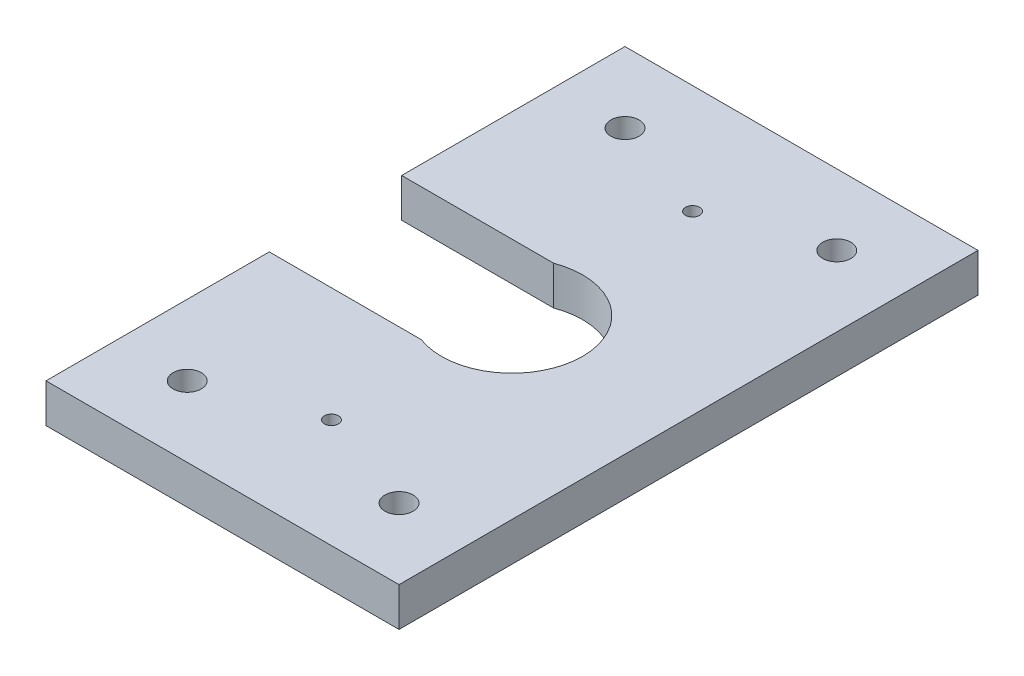
ISO-10303-21;
HEADER;
FILE_DESCRIPTION(('STEP AP214'),'2;1');
FILE_NAME('part.step','',(''),(''),'','','');
FILE_SCHEMA(('AUTOMOTIVE_DESIGN { 1 0 10303 214 1 1 1 1 }'));
ENDSEC;
DATA;
#1=APPLICATION_CONTEXT('core data for automotive mechanical design processes');
#2=APPLICATION_PROTOCOL_DEFINITION('international standard','automotive_design',2000,#1);
#3=PRODUCT_CONTEXT('',#1,'mechanical');
#4=PRODUCT('Part','Part','',(#3));
#5=PRODUCT_RELATED_PRODUCT_CATEGORY('part','',(#4));
#6=PRODUCT_DEFINITION_FORMATION('','',#4);
#7=PRODUCT_DEFINITION_CONTEXT('part definition',#1,'design');
#8=PRODUCT_DEFINITION('design','',#6,#7);
#9=PRODUCT_DEFINITION_SHAPE('','',#8);
#10=(LENGTH_UNIT() NAMED_UNIT(*) SI_UNIT(.MILLI.,.METRE.));
#11=(NAMED_UNIT(*) PLANE_ANGLE_UNIT() SI_UNIT($,.RADIAN.));
#12=(NAMED_UNIT(*) SI_UNIT($,.STERADIAN.) SOLID_ANGLE_UNIT());
#13=UNCERTAINTY_MEASURE_WITH_UNIT(LENGTH_MEASURE(1.E-05),#10,'distance_accuracy_value','');
#14=(GEOMETRIC_REPRESENTATION_CONTEXT(3) GLOBAL_UNCERTAINTY_ASSIGNED_CONTEXT((#13)) GLOBAL_UNIT_ASSIGNED_CONTEXT((#10,
#11,#12)) REPRESENTATION_CONTEXT('',''));
#15=CARTESIAN_POINT('',(0.,0.,0.));
#16=DIRECTION('',(0.,0.,1.));
#17=DIRECTION('',(1.,0.,0.));
#18=AXIS2_PLACEMENT_3D('',#15,#16,#17);
#19=CARTESIAN_POINT('',(0.,2.2,0.));
#20=DIRECTION('',(0.,-1.,0.));
#21=DIRECTION('',(0.,0.,-1.));
#22=AXIS2_PLACEMENT_3D('',#19,#20,#21);
#23=PLANE('',#22);
#24=DIRECTION('',(-1.,0.,0.));
#25=VECTOR('',#24,1.);
#26=CARTESIAN_POINT('',(8.60805890929249,2.2,12.65));
#27=LINE('',#26,#25);
#28=CARTESIAN_POINT('',(8.60805890929249,2.2,12.65));
#29=VERTEX_POINT('',#28);
#30=CARTESIAN_POINT('',(0.,2.2,12.65));
#31=VERTEX_POINT('',#30);
#32=EDGE_CURVE('E261',#29,#31,#27,.T.);
#33=ORIENTED_EDGE('',*,*,#32,.F.);
#34=CARTESIAN_POINT('',(9.9999999999999,2.2,16.4));
#35=DIRECTION('',(0.,1.,0.));
#36=DIRECTION('',(0.,0.,1.));
#37=AXIS2_PLACEMENT_3D('',#34,#35,#36);
#38=CIRCLE('',#37,4.);
#39=CARTESIAN_POINT('',(8.60805890929249,2.2,20.15));
#40=VERTEX_POINT('',#39);
#41=EDGE_CURVE('E260',#40,#29,#38,.T.);
#42=ORIENTED_EDGE('',*,*,#41,.F.);
#43=DIRECTION('',(-1.,0.,0.));
#44=VECTOR('',#43,1.);
#45=CARTESIAN_POINT('',(8.60805890929249,2.2,20.15));
#46=LINE('',#45,#44);
#47=CARTESIAN_POINT('',(0.,2.2,20.15));
#48=VERTEX_POINT('',#47);
#49=EDGE_CURVE('E204',#40,#48,#46,.T.);
#50=ORIENTED_EDGE('',*,*,#49,.T.);
#51=DIRECTION('',(0.,0.,1.));
#52=VECTOR('',#51,1.);
#53=CARTESIAN_POINT('',(0.,2.2,0.));
#54=LINE('',#53,#52);
#55=CARTESIAN_POINT('',(0.,2.2,32.7999999999999));
#56=VERTEX_POINT('',#55);
#57=EDGE_CURVE('E257',#48,#56,#54,.T.);
#58=ORIENTED_EDGE('',*,*,#57,.T.);
#59=DIRECTION('',(1.,0.,0.));
#60=VECTOR('',#59,1.);
#61=CARTESIAN_POINT('',(0.,2.2,32.7999999999999));
#62=LINE('',#61,#60);
#63=CARTESIAN_POINT('',(20.,2.2,32.7999999999999));
#64=VERTEX_POINT('',#63);
#65=EDGE_CURVE('E267',#56,#64,#62,.T.);
#66=ORIENTED_EDGE('',*,*,#65,.T.);
#67=DIRECTION('',(0.,0.,1.));
#68=VECTOR('',#67,1.);
#69=CARTESIAN_POINT('',(20.,2.2,0.));
#70=LINE('',#69,#68);
#71=CARTESIAN_POINT('',(20.,2.2,0.));
#72=VERTEX_POINT('',#71);
#73=EDGE_CURVE('E270',#72,#64,#70,.T.);
#74=ORIENTED_EDGE('',*,*,#73,.F.);
#75=DIRECTION('',(1.,0.,0.));
#76=VECTOR('',#75,1.);
#77=CARTESIAN_POINT('',(0.,2.2,0.));
#78=LINE('',#77,#76);
#79=CARTESIAN_POINT('',(0.,2.2,0.));
#80=VERTEX_POINT('',#79);
#81=EDGE_CURVE('E286',#80,#72,#78,.T.);
#82=ORIENTED_EDGE('',*,*,#81,.F.);
#83=EDGE_CURVE('E266',#80,#31,#54,.T.);
#84=ORIENTED_EDGE('',*,*,#83,.T.);
#85=EDGE_LOOP('',(#33,#42,#50,#58,#66,#74,#82,#84));
#86=FACE_BOUND('',#85,.T.);
#87=CARTESIAN_POINT('',(9.99999999999991,2.2,6.16999999999996));
#88=DIRECTION('',(0.,1.,0.));
#89=DIRECTION('',(0.,0.,1.));
#90=AXIS2_PLACEMENT_3D('',#87,#88,#89);
#91=CIRCLE('',#90,0.4);
#92=CARTESIAN_POINT('',(9.99999999999991,2.2,6.56999999999996));
#93=VERTEX_POINT('',#92);
#94=EDGE_CURVE('E320',#93,#93,#91,.T.);
#95=ORIENTED_EDGE('',*,*,#94,.F.);
#96=EDGE_LOOP('',(#95));
#97=FACE_BOUND('',#96,.T.);
#98=CARTESIAN_POINT('',(10.,2.2,26.63));
#99=DIRECTION('',(0.,1.,0.));
#100=DIRECTION('',(0.,0.,1.));
#101=AXIS2_PLACEMENT_3D('',#98,#99,#100);
#102=CIRCLE('',#101,0.4);
#103=CARTESIAN_POINT('',(10.,2.2,27.03));
#104=VERTEX_POINT('',#103);
#105=EDGE_CURVE('E325',#104,#104,#102,.T.);
#106=ORIENTED_EDGE('',*,*,#105,.F.);
#107=EDGE_LOOP('',(#106));
#108=FACE_BOUND('',#107,.T.);
#109=CARTESIAN_POINT('',(16.,2.2,28.7999999999999));
#110=DIRECTION('',(0.,1.,0.));
#111=DIRECTION('',(0.,0.,1.));
#112=AXIS2_PLACEMENT_3D('',#109,#110,#111);
#113=CIRCLE('',#112,0.799999999999999);
#114=CARTESIAN_POINT('',(16.,2.2,29.5999999999999));
#115=VERTEX_POINT('',#114);
#116=EDGE_CURVE('E331',#115,#115,#113,.T.);
#117=ORIENTED_EDGE('',*,*,#116,.F.);
#118=EDGE_LOOP('',(#117));
#119=FACE_BOUND('',#118,.T.);
#120=CARTESIAN_POINT('',(4.,2.2,28.7999999999999));
#121=DIRECTION('',(0.,1.,0.));
#122=DIRECTION('',(0.,0.,1.));
#123=AXIS2_PLACEMENT_3D('',#120,#121,#122);
#124=CIRCLE('',#123,0.8);
#125=CARTESIAN_POINT('',(4.,2.2,29.5999999999999));
#126=VERTEX_POINT('',#125);
#127=EDGE_CURVE('E337',#126,#126,#124,.T.);
#128=ORIENTED_EDGE('',*,*,#127,.F.);
#129=EDGE_LOOP('',(#128));
#130=FACE_BOUND('',#129,.T.);
#131=CARTESIAN_POINT('',(4.,2.2,4.));
#132=DIRECTION('',(0.,1.,0.));
#133=DIRECTION('',(0.,0.,1.));
#134=AXIS2_PLACEMENT_3D('',#131,#132,#133);
#135=CIRCLE('',#134,0.8);
#136=CARTESIAN_POINT('',(4.,2.2,4.8));
#137=VERTEX_POINT('',#136);
#138=EDGE_CURVE('E343',#137,#137,#135,.T.);
#139=ORIENTED_EDGE('',*,*,#138,.F.);
#140=EDGE_LOOP('',(#139));
#141=FACE_BOUND('',#140,.T.);
#142=CARTESIAN_POINT('',(16.,2.2,4.));
#143=DIRECTION('',(0.,1.,0.));
#144=DIRECTION('',(0.,0.,1.));
#145=AXIS2_PLACEMENT_3D('',#142,#143,#144);
#146=CIRCLE('',#145,0.799999999999999);
#147=CARTESIAN_POINT('',(16.,2.2,4.8));
#148=VERTEX_POINT('',#147);
#149=EDGE_CURVE('E349',#148,#148,#146,.T.);
#150=ORIENTED_EDGE('',*,*,#149,.F.);
#151=EDGE_LOOP('',(#150));
#152=FACE_BOUND('',#151,.T.);
#153=ADVANCED_FACE('F179',(#86,#97,#108,#119,#130,#141,#152),#23,.F.);
#154=CARTESIAN_POINT('',(0.,0.,0.));
#155=DIRECTION('',(0.,-1.,0.));
#156=DIRECTION('',(0.,0.,-1.));
#157=AXIS2_PLACEMENT_3D('',#154,#155,#156);
#158=PLANE('',#157);
#159=CARTESIAN_POINT('',(4.,0.,4.));
#160=DIRECTION('',(0.,1.,0.));
#161=DIRECTION('',(0.,0.,1.));
#162=AXIS2_PLACEMENT_3D('',#159,#160,#161);
#163=CIRCLE('',#162,0.8);
#164=CARTESIAN_POINT('',(4.,0.,4.8));
#165=VERTEX_POINT('',#164);
#166=EDGE_CURVE('E346',#165,#165,#163,.T.);
#167=ORIENTED_EDGE('',*,*,#166,.T.);
#168=EDGE_LOOP('',(#167));
#169=FACE_BOUND('',#168,.T.);
#170=CARTESIAN_POINT('',(16.,0.,28.7999999999999));
#171=DIRECTION('',(0.,1.,0.));
#172=DIRECTION('',(0.,0.,1.));
#173=AXIS2_PLACEMENT_3D('',#170,#171,#172);
#174=CIRCLE('',#173,0.799999999999999);
#175=CARTESIAN_POINT('',(16.,0.,29.5999999999999));
#176=VERTEX_POINT('',#175);
#177=EDGE_CURVE('E334',#176,#176,#174,.T.);
#178=ORIENTED_EDGE('',*,*,#177,.T.);
#179=EDGE_LOOP('',(#178));
#180=FACE_BOUND('',#179,.T.);
#181=CARTESIAN_POINT('',(9.99999999999991,0.,6.16999999999996));
#182=DIRECTION('',(0.,1.,0.));
#183=DIRECTION('',(0.,0.,1.));
#184=AXIS2_PLACEMENT_3D('',#181,#182,#183);
#185=CIRCLE('',#184,0.4);
#186=CARTESIAN_POINT('',(9.99999999999991,0.,6.56999999999996));
#187=VERTEX_POINT('',#186);
#188=EDGE_CURVE('E322',#187,#187,#185,.T.);
#189=ORIENTED_EDGE('',*,*,#188,.T.);
#190=EDGE_LOOP('',(#189));
#191=FACE_BOUND('',#190,.T.);
#192=CARTESIAN_POINT('',(9.9999999999999,0.,16.4));
#193=DIRECTION('',(0.,1.,0.));
#194=DIRECTION('',(0.,0.,1.));
#195=AXIS2_PLACEMENT_3D('',#192,#193,#194);
#196=CIRCLE('',#195,4.);
#197=CARTESIAN_POINT('',(8.60805890929249,0.,20.15));
#198=VERTEX_POINT('',#197);
#199=CARTESIAN_POINT('',(8.60805890929239,0.,12.65));
#200=VERTEX_POINT('',#199);
#201=EDGE_CURVE('E311',#198,#200,#196,.T.);
#202=ORIENTED_EDGE('',*,*,#201,.T.);
#203=DIRECTION('',(-1.,0.,0.));
#204=VECTOR('',#203,1.);
#205=CARTESIAN_POINT('',(8.60805890929249,0.,12.65));
#206=LINE('',#205,#204);
#207=CARTESIAN_POINT('',(0.,0.,12.65));
#208=VERTEX_POINT('',#207);
#209=EDGE_CURVE('E196',#200,#208,#206,.T.);
#210=ORIENTED_EDGE('',*,*,#209,.T.);
#211=DIRECTION('',(0.,0.,1.));
#212=VECTOR('',#211,1.);
#213=CARTESIAN_POINT('',(0.,0.,0.));
#214=LINE('',#213,#212);
#215=CARTESIAN_POINT('',(0.,0.,0.));
#216=VERTEX_POINT('',#215);
#217=EDGE_CURVE('E284',#216,#208,#214,.T.);
#218=ORIENTED_EDGE('',*,*,#217,.F.);
#219=DIRECTION('',(1.,0.,0.));
#220=VECTOR('',#219,1.);
#221=CARTESIAN_POINT('',(0.,0.,0.));
#222=LINE('',#221,#220);
#223=CARTESIAN_POINT('',(20.,0.,0.));
#224=VERTEX_POINT('',#223);
#225=EDGE_CURVE('E274',#216,#224,#222,.T.);
#226=ORIENTED_EDGE('',*,*,#225,.T.);
#227=DIRECTION('',(0.,0.,1.));
#228=VECTOR('',#227,1.);
#229=CARTESIAN_POINT('',(20.,0.,0.));
#230=LINE('',#229,#228);
#231=CARTESIAN_POINT('',(20.,0.,32.7999999999999));
#232=VERTEX_POINT('',#231);
#233=EDGE_CURVE('E277',#224,#232,#230,.T.);
#234=ORIENTED_EDGE('',*,*,#233,.T.);
#235=DIRECTION('',(1.,0.,0.));
#236=VECTOR('',#235,1.);
#237=CARTESIAN_POINT('',(0.,0.,32.7999999999999));
#238=LINE('',#237,#236);
#239=CARTESIAN_POINT('',(0.,0.,32.7999999999999));
#240=VERTEX_POINT('',#239);
#241=EDGE_CURVE('E280',#240,#232,#238,.T.);
#242=ORIENTED_EDGE('',*,*,#241,.F.);
#243=CARTESIAN_POINT('',(0.,0.,20.15));
#244=VERTEX_POINT('',#243);
#245=EDGE_CURVE('E283',#244,#240,#214,.T.);
#246=ORIENTED_EDGE('',*,*,#245,.F.);
#247=DIRECTION('',(-1.,0.,0.));
#248=VECTOR('',#247,1.);
#249=CARTESIAN_POINT('',(8.60805890929249,0.,20.15));
#250=LINE('',#249,#248);
#251=EDGE_CURVE('E246',#198,#244,#250,.T.);
#252=ORIENTED_EDGE('',*,*,#251,.F.);
#253=EDGE_LOOP('',(#202,#210,#218,#226,#234,#242,#246,#252));
#254=FACE_BOUND('',#253,.T.);
#255=CARTESIAN_POINT('',(10.,0.,26.63));
#256=DIRECTION('',(0.,1.,0.));
#257=DIRECTION('',(0.,0.,1.));
#258=AXIS2_PLACEMENT_3D('',#255,#256,#257);
#259=CIRCLE('',#258,0.4);
#260=CARTESIAN_POINT('',(10.,0.,27.03));
#261=VERTEX_POINT('',#260);
#262=EDGE_CURVE('E328',#261,#261,#259,.T.);
#263=ORIENTED_EDGE('',*,*,#262,.T.);
#264=EDGE_LOOP('',(#263));
#265=FACE_BOUND('',#264,.T.);
#266=CARTESIAN_POINT('',(4.,0.,28.7999999999999));
#267=DIRECTION('',(0.,1.,0.));
#268=DIRECTION('',(0.,0.,1.));
#269=AXIS2_PLACEMENT_3D('',#266,#267,#268);
#270=CIRCLE('',#269,0.8);
#271=CARTESIAN_POINT('',(4.,0.,29.5999999999999));
#272=VERTEX_POINT('',#271);
#273=EDGE_CURVE('E340',#272,#272,#270,.T.);
#274=ORIENTED_EDGE('',*,*,#273,.T.);
#275=EDGE_LOOP('',(#274));
#276=FACE_BOUND('',#275,.T.);
#277=CARTESIAN_POINT('',(16.,0.,4.));
#278=DIRECTION('',(0.,1.,0.));
#279=DIRECTION('',(0.,0.,1.));
#280=AXIS2_PLACEMENT_3D('',#277,#278,#279);
#281=CIRCLE('',#280,0.799999999999999);
#282=CARTESIAN_POINT('',(16.,0.,4.8));
#283=VERTEX_POINT('',#282);
#284=EDGE_CURVE('E352',#283,#283,#281,.T.);
#285=ORIENTED_EDGE('',*,*,#284,.T.);
#286=EDGE_LOOP('',(#285));
#287=FACE_BOUND('',#286,.T.);
#288=ADVANCED_FACE('F303',(#169,#180,#191,#254,#265,#276,#287),#158,.T.);
#289=CARTESIAN_POINT('',(0.,2.2,0.));
#290=DIRECTION('',(1.,0.,0.));
#291=DIRECTION('',(0.,0.,-1.));
#292=AXIS2_PLACEMENT_3D('',#289,#290,#291);
#293=PLANE('',#292);
#294=DIRECTION('',(0.,-1.,0.));
#295=VECTOR('',#294,1.);
#296=CARTESIAN_POINT('',(0.,2.2,12.65));
#297=LINE('',#296,#295);
#298=EDGE_CURVE('E250',#31,#208,#297,.T.);
#299=ORIENTED_EDGE('',*,*,#298,.F.);
#300=ORIENTED_EDGE('',*,*,#83,.F.);
#301=DIRECTION('',(0.,-1.,0.));
#302=VECTOR('',#301,1.);
#303=CARTESIAN_POINT('',(0.,2.2,0.));
#304=LINE('',#303,#302);
#305=EDGE_CURVE('E12',#80,#216,#304,.T.);
#306=ORIENTED_EDGE('',*,*,#305,.T.);
#307=ORIENTED_EDGE('',*,*,#217,.T.);
#308=EDGE_LOOP('',(#299,#300,#306,#307));
#309=FACE_BOUND('',#308,.T.);
#310=ADVANCED_FACE('F307',(#309),#293,.F.);
#311=CARTESIAN_POINT('',(9.9999999999999,2.2,16.4));
#312=DIRECTION('',(0.,-1.,0.));
#313=DIRECTION('',(0.,0.,-1.));
#314=AXIS2_PLACEMENT_3D('',#311,#312,#313);
#315=CYLINDRICAL_SURFACE('',#314,4.);
#316=ORIENTED_EDGE('',*,*,#41,.T.);
#317=DIRECTION('',(0.,-1.,0.));
#318=VECTOR('',#317,1.);
#319=CARTESIAN_POINT('',(8.60805890929249,2.2,12.65));
#320=LINE('',#319,#318);
#321=EDGE_CURVE('E313',#29,#200,#320,.T.);
#322=ORIENTED_EDGE('',*,*,#321,.T.);
#323=ORIENTED_EDGE('',*,*,#201,.F.);
#324=DIRECTION('',(0.,-1.,0.));
#325=VECTOR('',#324,1.);
#326=CARTESIAN_POINT('',(8.60805890929249,2.2,20.15));
#327=LINE('',#326,#325);
#328=EDGE_CURVE('E251',#40,#198,#327,.T.);
#329=ORIENTED_EDGE('',*,*,#328,.F.);
#330=EDGE_LOOP('',(#316,#322,#323,#329));
#331=FACE_BOUND('',#330,.T.);
#332=ADVANCED_FACE('F369',(#331),#315,.F.);
#333=CARTESIAN_POINT('',(0.,2.2,0.));
#334=DIRECTION('',(0.,0.,-1.));
#335=DIRECTION('',(-1.,0.,0.));
#336=AXIS2_PLACEMENT_3D('',#333,#334,#335);
#337=PLANE('',#336);
#338=ORIENTED_EDGE('',*,*,#225,.F.);
#339=ORIENTED_EDGE('',*,*,#305,.F.);
#340=ORIENTED_EDGE('',*,*,#81,.T.);
#341=DIRECTION('',(0.,-1.,0.));
#342=VECTOR('',#341,1.);
#343=CARTESIAN_POINT('',(20.,2.2,0.));
#344=LINE('',#343,#342);
#345=EDGE_CURVE('E183',#72,#224,#344,.T.);
#346=ORIENTED_EDGE('',*,*,#345,.T.);
#347=EDGE_LOOP('',(#338,#339,#340,#346));
#348=FACE_BOUND('',#347,.T.);
#349=ADVANCED_FACE('F181',(#348),#337,.T.);
#350=ORIENTED_EDGE('',*,*,#57,.F.);
#351=DIRECTION('',(0.,-1.,0.));
#352=VECTOR('',#351,1.);
#353=CARTESIAN_POINT('',(0.,2.2,20.15));
#354=LINE('',#353,#352);
#355=EDGE_CURVE('E243',#48,#244,#354,.T.);
#356=ORIENTED_EDGE('',*,*,#355,.T.);
#357=ORIENTED_EDGE('',*,*,#245,.T.);
#358=DIRECTION('',(0.,-1.,0.));
#359=VECTOR('',#358,1.);
#360=CARTESIAN_POINT('',(0.,2.2,32.7999999999999));
#361=LINE('',#360,#359);
#362=EDGE_CURVE('E188',#56,#240,#361,.T.);
#363=ORIENTED_EDGE('',*,*,#362,.F.);
#364=EDGE_LOOP('',(#350,#356,#357,#363));
#365=FACE_BOUND('',#364,.T.);
#366=ADVANCED_FACE('F263',(#365),#293,.F.);
#367=CARTESIAN_POINT('',(0.,2.2,32.7999999999999));
#368=DIRECTION('',(0.,0.,-1.));
#369=DIRECTION('',(-1.,0.,0.));
#370=AXIS2_PLACEMENT_3D('',#367,#368,#369);
#371=PLANE('',#370);
#372=ORIENTED_EDGE('',*,*,#241,.T.);
#373=DIRECTION('',(0.,-1.,0.));
#374=VECTOR('',#373,1.);
#375=CARTESIAN_POINT('',(20.,2.2,32.7999999999999));
#376=LINE('',#375,#374);
#377=EDGE_CURVE('E288',#64,#232,#376,.T.);
#378=ORIENTED_EDGE('',*,*,#377,.F.);
#379=ORIENTED_EDGE('',*,*,#65,.F.);
#380=ORIENTED_EDGE('',*,*,#362,.T.);
#381=EDGE_LOOP('',(#372,#378,#379,#380));
#382=FACE_BOUND('',#381,.T.);
#383=ADVANCED_FACE('F374',(#382),#371,.F.);
#384=CARTESIAN_POINT('',(20.,2.2,0.));
#385=DIRECTION('',(1.,0.,0.));
#386=DIRECTION('',(0.,0.,-1.));
#387=AXIS2_PLACEMENT_3D('',#384,#385,#386);
#388=PLANE('',#387);
#389=ORIENTED_EDGE('',*,*,#233,.F.);
#390=ORIENTED_EDGE('',*,*,#345,.F.);
#391=ORIENTED_EDGE('',*,*,#73,.T.);
#392=ORIENTED_EDGE('',*,*,#377,.T.);
#393=EDGE_LOOP('',(#389,#390,#391,#392));
#394=FACE_BOUND('',#393,.T.);
#395=ADVANCED_FACE('F298',(#394),#388,.T.);
#396=CARTESIAN_POINT('',(8.60805890929249,2.2,20.15));
#397=DIRECTION('',(0.,0.,1.));
#398=DIRECTION('',(1.,0.,0.));
#399=AXIS2_PLACEMENT_3D('',#396,#397,#398);
#400=PLANE('',#399);
#401=ORIENTED_EDGE('',*,*,#251,.T.);
#402=ORIENTED_EDGE('',*,*,#355,.F.);
#403=ORIENTED_EDGE('',*,*,#49,.F.);
#404=ORIENTED_EDGE('',*,*,#328,.T.);
#405=EDGE_LOOP('',(#401,#402,#403,#404));
#406=FACE_BOUND('',#405,.T.);
#407=ADVANCED_FACE('F244',(#406),#400,.F.);
#408=CARTESIAN_POINT('',(8.60805890929249,2.2,12.65));
#409=DIRECTION('',(0.,0.,1.));
#410=DIRECTION('',(1.,0.,0.));
#411=AXIS2_PLACEMENT_3D('',#408,#409,#410);
#412=PLANE('',#411);
#413=ORIENTED_EDGE('',*,*,#209,.F.);
#414=ORIENTED_EDGE('',*,*,#321,.F.);
#415=ORIENTED_EDGE('',*,*,#32,.T.);
#416=ORIENTED_EDGE('',*,*,#298,.T.);
#417=EDGE_LOOP('',(#413,#414,#415,#416));
#418=FACE_BOUND('',#417,.T.);
#419=ADVANCED_FACE('F381',(#418),#412,.T.);
#420=CARTESIAN_POINT('',(9.99999999999991,2.2,6.16999999999996));
#421=DIRECTION('',(0.,-1.,0.));
#422=DIRECTION('',(0.,0.,-1.));
#423=AXIS2_PLACEMENT_3D('',#420,#421,#422);
#424=CYLINDRICAL_SURFACE('',#423,0.4);
#425=ORIENTED_EDGE('',*,*,#94,.T.);
#426=EDGE_LOOP('',(#425));
#427=FACE_BOUND('',#426,.T.);
#428=ORIENTED_EDGE('',*,*,#188,.F.);
#429=EDGE_LOOP('',(#428));
#430=FACE_BOUND('',#429,.T.);
#431=ADVANCED_FACE('F385',(#427,#430),#424,.F.);
#432=CARTESIAN_POINT('',(10.,2.2,26.63));
#433=DIRECTION('',(0.,-1.,0.));
#434=DIRECTION('',(0.,0.,-1.));
#435=AXIS2_PLACEMENT_3D('',#432,#433,#434);
#436=CYLINDRICAL_SURFACE('',#435,0.4);
#437=ORIENTED_EDGE('',*,*,#105,.T.);
#438=EDGE_LOOP('',(#437));
#439=FACE_BOUND('',#438,.T.);
#440=ORIENTED_EDGE('',*,*,#262,.F.);
#441=EDGE_LOOP('',(#440));
#442=FACE_BOUND('',#441,.T.);
#443=ADVANCED_FACE('F390',(#439,#442),#436,.F.);
#444=CARTESIAN_POINT('',(16.,2.2,28.7999999999999));
#445=DIRECTION('',(0.,-1.,0.));
#446=DIRECTION('',(0.,0.,-1.));
#447=AXIS2_PLACEMENT_3D('',#444,#445,#446);
#448=CYLINDRICAL_SURFACE('',#447,0.799999999999999);
#449=ORIENTED_EDGE('',*,*,#116,.T.);
#450=EDGE_LOOP('',(#449));
#451=FACE_BOUND('',#450,.T.);
#452=ORIENTED_EDGE('',*,*,#177,.F.);
#453=EDGE_LOOP('',(#452));
#454=FACE_BOUND('',#453,.T.);
#455=ADVANCED_FACE('F394',(#451,#454),#448,.F.);
#456=CARTESIAN_POINT('',(4.,2.2,28.7999999999999));
#457=DIRECTION('',(0.,-1.,0.));
#458=DIRECTION('',(0.,0.,-1.));
#459=AXIS2_PLACEMENT_3D('',#456,#457,#458);
#460=CYLINDRICAL_SURFACE('',#459,0.8);
#461=ORIENTED_EDGE('',*,*,#127,.T.);
#462=EDGE_LOOP('',(#461));
#463=FACE_BOUND('',#462,.T.);
#464=ORIENTED_EDGE('',*,*,#273,.F.);
#465=EDGE_LOOP('',(#464));
#466=FACE_BOUND('',#465,.T.);
#467=ADVANCED_FACE('F398',(#463,#466),#460,.F.);
#468=CARTESIAN_POINT('',(4.,2.2,4.));
#469=DIRECTION('',(0.,-1.,0.));
#470=DIRECTION('',(0.,0.,-1.));
#471=AXIS2_PLACEMENT_3D('',#468,#469,#470);
#472=CYLINDRICAL_SURFACE('',#471,0.8);
#473=ORIENTED_EDGE('',*,*,#138,.T.);
#474=EDGE_LOOP('',(#473));
#475=FACE_BOUND('',#474,.T.);
#476=ORIENTED_EDGE('',*,*,#166,.F.);
#477=EDGE_LOOP('',(#476));
#478=FACE_BOUND('',#477,.T.);
#479=ADVANCED_FACE('F402',(#475,#478),#472,.F.);
#480=CARTESIAN_POINT('',(16.,2.2,4.));
#481=DIRECTION('',(0.,-1.,0.));
#482=DIRECTION('',(0.,0.,-1.));
#483=AXIS2_PLACEMENT_3D('',#480,#481,#482);
#484=CYLINDRICAL_SURFACE('',#483,0.799999999999999);
#485=ORIENTED_EDGE('',*,*,#149,.T.);
#486=EDGE_LOOP('',(#485));
#487=FACE_BOUND('',#486,.T.);
#488=ORIENTED_EDGE('',*,*,#284,.F.);
#489=EDGE_LOOP('',(#488));
#490=FACE_BOUND('',#489,.T.);
#491=ADVANCED_FACE('F358',(#487,#490),#484,.F.);
#492=CLOSED_SHELL('',(#153,#288,#310,#332,#349,#366,#383,#395,#407,#419,#431,#443,#455,#467,
#479,#491));
#493=MANIFOLD_SOLID_BREP('B2',#492);
#494=ADVANCED_BREP_SHAPE_REPRESENTATION('',(#18,#493),#14);
#495=SHAPE_DEFINITION_REPRESENTATION(#9,#494);
ENDSEC;
END-ISO-10303-21;
